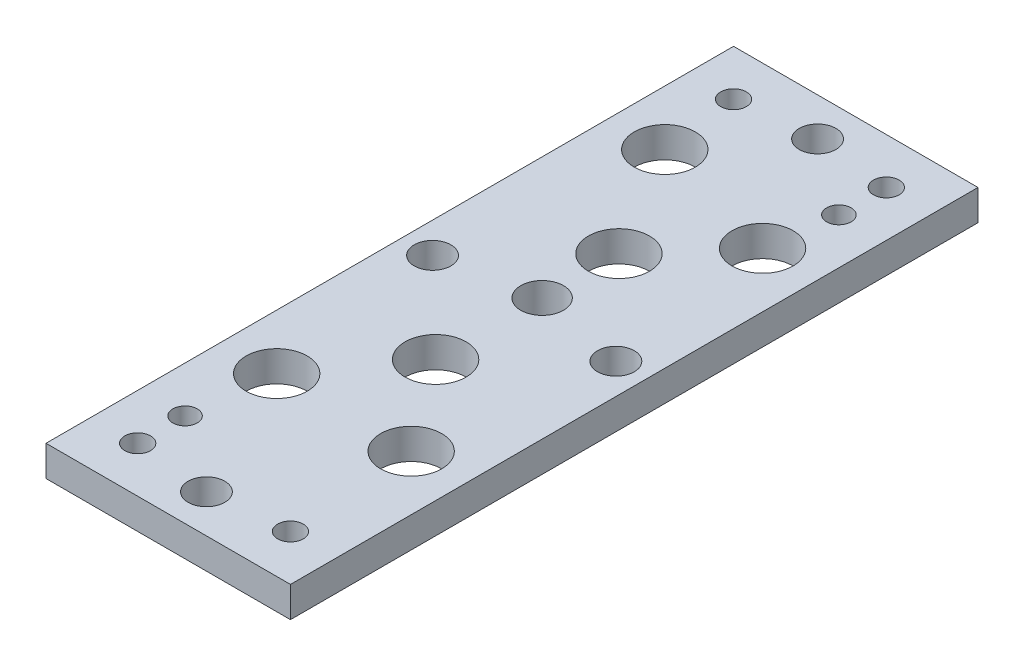
ISO-10303-21;
HEADER;
FILE_DESCRIPTION(('STEP AP214'),'2;1');
FILE_NAME('part.step','',(''),(''),'','','');
FILE_SCHEMA(('AUTOMOTIVE_DESIGN { 1 0 10303 214 1 1 1 1 }'));
ENDSEC;
DATA;
#1=APPLICATION_CONTEXT('core data for automotive mechanical design processes');
#2=APPLICATION_PROTOCOL_DEFINITION('international standard','automotive_design',2000,#1);
#3=PRODUCT_CONTEXT('',#1,'mechanical');
#4=PRODUCT('Part','Part','',(#3));
#5=PRODUCT_RELATED_PRODUCT_CATEGORY('part','',(#4));
#6=PRODUCT_DEFINITION_FORMATION('','',#4);
#7=PRODUCT_DEFINITION_CONTEXT('part definition',#1,'design');
#8=PRODUCT_DEFINITION('design','',#6,#7);
#9=PRODUCT_DEFINITION_SHAPE('','',#8);
#10=(LENGTH_UNIT() NAMED_UNIT(*) SI_UNIT(.MILLI.,.METRE.));
#11=(NAMED_UNIT(*) PLANE_ANGLE_UNIT() SI_UNIT($,.RADIAN.));
#12=(NAMED_UNIT(*) SI_UNIT($,.STERADIAN.) SOLID_ANGLE_UNIT());
#13=UNCERTAINTY_MEASURE_WITH_UNIT(LENGTH_MEASURE(1.E-05),#10,'distance_accuracy_value','');
#14=(GEOMETRIC_REPRESENTATION_CONTEXT(3) GLOBAL_UNCERTAINTY_ASSIGNED_CONTEXT((#13)) GLOBAL_UNIT_ASSIGNED_CONTEXT((#10,
#11,#12)) REPRESENTATION_CONTEXT('',''));
#15=CARTESIAN_POINT('',(0.,0.,0.));
#16=DIRECTION('',(0.,0.,1.));
#17=DIRECTION('',(1.,0.,0.));
#18=AXIS2_PLACEMENT_3D('',#15,#16,#17);
#19=CARTESIAN_POINT('',(40.,-10.,112.5));
#20=DIRECTION('',(1.,0.,0.));
#21=DIRECTION('',(0.,0.,-1.));
#22=AXIS2_PLACEMENT_3D('',#19,#20,#21);
#23=PLANE('',#22);
#24=DIRECTION('',(0.,0.,-1.));
#25=VECTOR('',#24,1.);
#26=CARTESIAN_POINT('',(40.,0.,112.5));
#27=LINE('',#26,#25);
#28=CARTESIAN_POINT('',(40.,0.,112.5));
#29=VERTEX_POINT('',#28);
#30=CARTESIAN_POINT('',(40.,0.,-112.5));
#31=VERTEX_POINT('',#30);
#32=EDGE_CURVE('E105',#29,#31,#27,.T.);
#33=ORIENTED_EDGE('',*,*,#32,.F.);
#34=DIRECTION('',(0.,1.,0.));
#35=VECTOR('',#34,1.);
#36=CARTESIAN_POINT('',(40.,-10.,112.5));
#37=LINE('',#36,#35);
#38=CARTESIAN_POINT('',(40.,-10.,112.5));
#39=VERTEX_POINT('',#38);
#40=EDGE_CURVE('E11',#39,#29,#37,.T.);
#41=ORIENTED_EDGE('',*,*,#40,.F.);
#42=DIRECTION('',(0.,0.,-1.));
#43=VECTOR('',#42,1.);
#44=CARTESIAN_POINT('',(40.,-10.,112.5));
#45=LINE('',#44,#43);
#46=CARTESIAN_POINT('',(40.,-10.,-112.5));
#47=VERTEX_POINT('',#46);
#48=EDGE_CURVE('E98',#39,#47,#45,.T.);
#49=ORIENTED_EDGE('',*,*,#48,.T.);
#50=DIRECTION('',(0.,1.,0.));
#51=VECTOR('',#50,1.);
#52=CARTESIAN_POINT('',(40.,-10.,-112.5));
#53=LINE('',#52,#51);
#54=EDGE_CURVE('E43',#47,#31,#53,.T.);
#55=ORIENTED_EDGE('',*,*,#54,.T.);
#56=EDGE_LOOP('',(#33,#41,#49,#55));
#57=FACE_BOUND('',#56,.T.);
#58=ADVANCED_FACE('F40',(#57),#23,.T.);
#59=CARTESIAN_POINT('',(-40.,-10.,112.5));
#60=DIRECTION('',(0.,0.,1.));
#61=DIRECTION('',(1.,0.,0.));
#62=AXIS2_PLACEMENT_3D('',#59,#60,#61);
#63=PLANE('',#62);
#64=DIRECTION('',(1.,0.,0.));
#65=VECTOR('',#64,1.);
#66=CARTESIAN_POINT('',(-40.,0.,112.5));
#67=LINE('',#66,#65);
#68=CARTESIAN_POINT('',(-40.,0.,112.5));
#69=VERTEX_POINT('',#68);
#70=EDGE_CURVE('E100',#69,#29,#67,.T.);
#71=ORIENTED_EDGE('',*,*,#70,.F.);
#72=DIRECTION('',(0.,1.,0.));
#73=VECTOR('',#72,1.);
#74=CARTESIAN_POINT('',(-40.,-10.,112.5));
#75=LINE('',#74,#73);
#76=CARTESIAN_POINT('',(-40.,-10.,112.5));
#77=VERTEX_POINT('',#76);
#78=EDGE_CURVE('E49',#77,#69,#75,.T.);
#79=ORIENTED_EDGE('',*,*,#78,.F.);
#80=DIRECTION('',(1.,0.,0.));
#81=VECTOR('',#80,1.);
#82=CARTESIAN_POINT('',(-40.,-10.,112.5));
#83=LINE('',#82,#81);
#84=EDGE_CURVE('E95',#77,#39,#83,.T.);
#85=ORIENTED_EDGE('',*,*,#84,.T.);
#86=ORIENTED_EDGE('',*,*,#40,.T.);
#87=EDGE_LOOP('',(#71,#79,#85,#86));
#88=FACE_BOUND('',#87,.T.);
#89=ADVANCED_FACE('F116',(#88),#63,.T.);
#90=CARTESIAN_POINT('',(-40.,-10.,112.5));
#91=DIRECTION('',(-1.,0.,0.));
#92=DIRECTION('',(0.,0.,1.));
#93=AXIS2_PLACEMENT_3D('',#90,#91,#92);
#94=PLANE('',#93);
#95=DIRECTION('',(0.,0.,1.));
#96=VECTOR('',#95,1.);
#97=CARTESIAN_POINT('',(-40.,0.,112.5));
#98=LINE('',#97,#96);
#99=CARTESIAN_POINT('',(-40.,0.,-112.5));
#100=VERTEX_POINT('',#99);
#101=EDGE_CURVE('E90',#100,#69,#98,.T.);
#102=ORIENTED_EDGE('',*,*,#101,.F.);
#103=DIRECTION('',(0.,1.,0.));
#104=VECTOR('',#103,1.);
#105=CARTESIAN_POINT('',(-40.,-10.,-112.5));
#106=LINE('',#105,#104);
#107=CARTESIAN_POINT('',(-40.,-10.,-112.5));
#108=VERTEX_POINT('',#107);
#109=EDGE_CURVE('E85',#108,#100,#106,.T.);
#110=ORIENTED_EDGE('',*,*,#109,.F.);
#111=DIRECTION('',(0.,0.,1.));
#112=VECTOR('',#111,1.);
#113=CARTESIAN_POINT('',(-40.,-10.,112.5));
#114=LINE('',#113,#112);
#115=EDGE_CURVE('E88',#108,#77,#114,.T.);
#116=ORIENTED_EDGE('',*,*,#115,.T.);
#117=ORIENTED_EDGE('',*,*,#78,.T.);
#118=EDGE_LOOP('',(#102,#110,#116,#117));
#119=FACE_BOUND('',#118,.T.);
#120=ADVANCED_FACE('F87',(#119),#94,.T.);
#121=CARTESIAN_POINT('',(-40.,-10.,-112.5));
#122=DIRECTION('',(0.,0.,-1.));
#123=DIRECTION('',(-1.,0.,0.));
#124=AXIS2_PLACEMENT_3D('',#121,#122,#123);
#125=PLANE('',#124);
#126=DIRECTION('',(-1.,0.,0.));
#127=VECTOR('',#126,1.);
#128=CARTESIAN_POINT('',(-40.,0.,-112.5));
#129=LINE('',#128,#127);
#130=EDGE_CURVE('E108',#31,#100,#129,.T.);
#131=ORIENTED_EDGE('',*,*,#130,.F.);
#132=ORIENTED_EDGE('',*,*,#54,.F.);
#133=DIRECTION('',(-1.,0.,0.));
#134=VECTOR('',#133,1.);
#135=CARTESIAN_POINT('',(-40.,-10.,-112.5));
#136=LINE('',#135,#134);
#137=EDGE_CURVE('E94',#47,#108,#136,.T.);
#138=ORIENTED_EDGE('',*,*,#137,.T.);
#139=ORIENTED_EDGE('',*,*,#109,.T.);
#140=EDGE_LOOP('',(#131,#132,#138,#139));
#141=FACE_BOUND('',#140,.T.);
#142=ADVANCED_FACE('F97',(#141),#125,.T.);
#143=CARTESIAN_POINT('',(0.,-10.,0.));
#144=DIRECTION('',(0.,-1.,0.));
#145=DIRECTION('',(0.,0.,-1.));
#146=AXIS2_PLACEMENT_3D('',#143,#144,#145);
#147=PLANE('',#146);
#148=CARTESIAN_POINT('',(22.,-10.,55.));
#149=DIRECTION('',(0.,1.,0.));
#150=DIRECTION('',(0.,0.,1.));
#151=AXIS2_PLACEMENT_3D('',#148,#149,#150);
#152=CIRCLE('',#151,10.0000000000001);
#153=CARTESIAN_POINT('',(22.,-10.,65.0000000000001));
#154=VERTEX_POINT('',#153);
#155=EDGE_CURVE('E240',#154,#154,#152,.T.);
#156=ORIENTED_EDGE('',*,*,#155,.T.);
#157=EDGE_LOOP('',(#156));
#158=FACE_BOUND('',#157,.T.);
#159=CARTESIAN_POINT('',(-22.,-10.,55.));
#160=DIRECTION('',(0.,1.,0.));
#161=DIRECTION('',(0.,0.,1.));
#162=AXIS2_PLACEMENT_3D('',#159,#160,#161);
#163=CIRCLE('',#162,10.0000000000001);
#164=CARTESIAN_POINT('',(-22.,-10.,65.0000000000001));
#165=VERTEX_POINT('',#164);
#166=EDGE_CURVE('E234',#165,#165,#163,.T.);
#167=ORIENTED_EDGE('',*,*,#166,.T.);
#168=EDGE_LOOP('',(#167));
#169=FACE_BOUND('',#168,.T.);
#170=CARTESIAN_POINT('',(0.,-10.,25.));
#171=DIRECTION('',(0.,1.,0.));
#172=DIRECTION('',(0.,0.,1.));
#173=AXIS2_PLACEMENT_3D('',#170,#171,#172);
#174=CIRCLE('',#173,10.0000000000001);
#175=CARTESIAN_POINT('',(0.,-10.,35.0000000000001));
#176=VERTEX_POINT('',#175);
#177=EDGE_CURVE('E228',#176,#176,#174,.T.);
#178=ORIENTED_EDGE('',*,*,#177,.T.);
#179=EDGE_LOOP('',(#178));
#180=FACE_BOUND('',#179,.T.);
#181=CARTESIAN_POINT('',(0.,-10.,-35.));
#182=DIRECTION('',(0.,1.,0.));
#183=DIRECTION('',(0.,0.,1.));
#184=AXIS2_PLACEMENT_3D('',#181,#182,#183);
#185=CIRCLE('',#184,10.0000000000001);
#186=CARTESIAN_POINT('',(0.,-10.,-24.9999999999999));
#187=VERTEX_POINT('',#186);
#188=EDGE_CURVE('E220',#187,#187,#185,.T.);
#189=ORIENTED_EDGE('',*,*,#188,.T.);
#190=EDGE_LOOP('',(#189));
#191=FACE_BOUND('',#190,.T.);
#192=CARTESIAN_POINT('',(-22.,-10.,-72.));
#193=DIRECTION('',(0.,1.,0.));
#194=DIRECTION('',(0.,0.,1.));
#195=AXIS2_PLACEMENT_3D('',#192,#193,#194);
#196=CIRCLE('',#195,10.0000000000001);
#197=CARTESIAN_POINT('',(-22.,-10.,-61.9999999999999));
#198=VERTEX_POINT('',#197);
#199=EDGE_CURVE('E213',#198,#198,#196,.T.);
#200=ORIENTED_EDGE('',*,*,#199,.T.);
#201=EDGE_LOOP('',(#200));
#202=FACE_BOUND('',#201,.T.);
#203=CARTESIAN_POINT('',(22.,-10.,-60.));
#204=DIRECTION('',(0.,1.,0.));
#205=DIRECTION('',(0.,0.,1.));
#206=AXIS2_PLACEMENT_3D('',#203,#204,#205);
#207=CIRCLE('',#206,10.0000000000001);
#208=CARTESIAN_POINT('',(22.,-10.,-50.));
#209=VERTEX_POINT('',#208);
#210=EDGE_CURVE('E215',#209,#209,#207,.T.);
#211=ORIENTED_EDGE('',*,*,#210,.T.);
#212=EDGE_LOOP('',(#211));
#213=FACE_BOUND('',#212,.T.);
#214=CARTESIAN_POINT('',(0.,-10.,-9.85999999999571));
#215=DIRECTION('',(0.,-1.,0.));
#216=DIRECTION('',(0.,0.,-1.));
#217=AXIS2_PLACEMENT_3D('',#214,#215,#216);
#218=CIRCLE('',#217,6.99999999999995);
#219=CARTESIAN_POINT('',(0.,-10.,-16.8599999999957));
#220=VERTEX_POINT('',#219);
#221=EDGE_CURVE('E246',#220,#220,#218,.F.);
#222=ORIENTED_EDGE('',*,*,#221,.T.);
#223=EDGE_LOOP('',(#222));
#224=FACE_BOUND('',#223,.T.);
#225=CARTESIAN_POINT('',(24.9999999999999,-10.,-81.975));
#226=DIRECTION('',(0.,1.,0.));
#227=DIRECTION('',(0.,0.,1.));
#228=AXIS2_PLACEMENT_3D('',#225,#226,#227);
#229=CIRCLE('',#228,4.);
#230=CARTESIAN_POINT('',(24.9999999999999,-10.,-77.975));
#231=VERTEX_POINT('',#230);
#232=EDGE_CURVE('E256',#231,#231,#229,.T.);
#233=ORIENTED_EDGE('',*,*,#232,.T.);
#234=EDGE_LOOP('',(#233));
#235=FACE_BOUND('',#234,.T.);
#236=CARTESIAN_POINT('',(-25.0000000000001,-10.,82.));
#237=DIRECTION('',(0.,1.,0.));
#238=DIRECTION('',(0.,0.,1.));
#239=AXIS2_PLACEMENT_3D('',#236,#237,#238);
#240=CIRCLE('',#239,4.);
#241=CARTESIAN_POINT('',(-25.0000000000001,-10.,86.));
#242=VERTEX_POINT('',#241);
#243=EDGE_CURVE('E262',#242,#242,#240,.T.);
#244=ORIENTED_EDGE('',*,*,#243,.T.);
#245=EDGE_LOOP('',(#244));
#246=FACE_BOUND('',#245,.T.);
#247=CARTESIAN_POINT('',(-25.0000000000001,-10.,-97.5));
#248=DIRECTION('',(0.,1.,0.));
#249=DIRECTION('',(0.,0.,1.));
#250=AXIS2_PLACEMENT_3D('',#247,#248,#249);
#251=CIRCLE('',#250,4.2);
#252=CARTESIAN_POINT('',(-25.0000000000001,-10.,-93.3));
#253=VERTEX_POINT('',#252);
#254=EDGE_CURVE('E268',#253,#253,#251,.T.);
#255=ORIENTED_EDGE('',*,*,#254,.T.);
#256=EDGE_LOOP('',(#255));
#257=FACE_BOUND('',#256,.T.);
#258=CARTESIAN_POINT('',(24.9999999999999,-10.,-97.5));
#259=DIRECTION('',(0.,1.,0.));
#260=DIRECTION('',(0.,0.,1.));
#261=AXIS2_PLACEMENT_3D('',#258,#259,#260);
#262=CIRCLE('',#261,4.2);
#263=CARTESIAN_POINT('',(24.9999999999999,-10.,-93.3));
#264=VERTEX_POINT('',#263);
#265=EDGE_CURVE('E274',#264,#264,#262,.T.);
#266=ORIENTED_EDGE('',*,*,#265,.T.);
#267=EDGE_LOOP('',(#266));
#268=FACE_BOUND('',#267,.T.);
#269=CARTESIAN_POINT('',(24.9999999999999,-10.,97.5));
#270=DIRECTION('',(0.,1.,0.));
#271=DIRECTION('',(0.,0.,1.));
#272=AXIS2_PLACEMENT_3D('',#269,#270,#271);
#273=CIRCLE('',#272,4.2);
#274=CARTESIAN_POINT('',(24.9999999999999,-10.,101.7));
#275=VERTEX_POINT('',#274);
#276=EDGE_CURVE('E280',#275,#275,#273,.T.);
#277=ORIENTED_EDGE('',*,*,#276,.T.);
#278=EDGE_LOOP('',(#277));
#279=FACE_BOUND('',#278,.T.);
#280=CARTESIAN_POINT('',(-25.0000000000001,-10.,97.5));
#281=DIRECTION('',(0.,1.,0.));
#282=DIRECTION('',(0.,0.,1.));
#283=AXIS2_PLACEMENT_3D('',#280,#281,#282);
#284=CIRCLE('',#283,4.2);
#285=CARTESIAN_POINT('',(-25.0000000000001,-10.,101.7));
#286=VERTEX_POINT('',#285);
#287=EDGE_CURVE('E286',#286,#286,#284,.T.);
#288=ORIENTED_EDGE('',*,*,#287,.T.);
#289=EDGE_LOOP('',(#288));
#290=FACE_BOUND('',#289,.T.);
#291=CARTESIAN_POINT('',(6.10622663543836E-13,-10.,-100.000000000007));
#292=DIRECTION('',(0.,-1.,0.));
#293=DIRECTION('',(0.,0.,-1.));
#294=AXIS2_PLACEMENT_3D('',#291,#292,#293);
#295=CIRCLE('',#294,5.9999999999999);
#296=CARTESIAN_POINT('',(6.10622663543836E-13,-10.,-106.000000000007));
#297=VERTEX_POINT('',#296);
#298=EDGE_CURVE('E292',#297,#297,#295,.F.);
#299=ORIENTED_EDGE('',*,*,#298,.T.);
#300=EDGE_LOOP('',(#299));
#301=FACE_BOUND('',#300,.T.);
#302=CARTESIAN_POINT('',(30.0000000000001,-10.,-4.00000000000001));
#303=DIRECTION('',(0.,-1.,0.));
#304=DIRECTION('',(0.,0.,-1.));
#305=AXIS2_PLACEMENT_3D('',#302,#303,#304);
#306=CIRCLE('',#305,5.9999999999999);
#307=CARTESIAN_POINT('',(30.0000000000001,-10.,-9.99999999999991));
#308=VERTEX_POINT('',#307);
#309=EDGE_CURVE('E295',#308,#308,#306,.F.);
#310=ORIENTED_EDGE('',*,*,#309,.T.);
#311=EDGE_LOOP('',(#310));
#312=FACE_BOUND('',#311,.T.);
#313=CARTESIAN_POINT('',(-29.9999999999999,-10.,-4.00000000000001));
#314=DIRECTION('',(0.,-1.,0.));
#315=DIRECTION('',(0.,0.,-1.));
#316=AXIS2_PLACEMENT_3D('',#313,#314,#315);
#317=CIRCLE('',#316,5.99999999999989);
#318=CARTESIAN_POINT('',(-29.9999999999999,-10.,-9.99999999999991));
#319=VERTEX_POINT('',#318);
#320=EDGE_CURVE('E301',#319,#319,#317,.F.);
#321=ORIENTED_EDGE('',*,*,#320,.T.);
#322=EDGE_LOOP('',(#321));
#323=FACE_BOUND('',#322,.T.);
#324=CARTESIAN_POINT('',(6.10622663543836E-13,-10.,100.000000000003));
#325=DIRECTION('',(0.,-1.,0.));
#326=DIRECTION('',(0.,0.,-1.));
#327=AXIS2_PLACEMENT_3D('',#324,#325,#326);
#328=CIRCLE('',#327,5.9999999999999);
#329=CARTESIAN_POINT('',(6.10622663543836E-13,-10.,94.0000000000029));
#330=VERTEX_POINT('',#329);
#331=EDGE_CURVE('E307',#330,#330,#328,.F.);
#332=ORIENTED_EDGE('',*,*,#331,.T.);
#333=EDGE_LOOP('',(#332));
#334=FACE_BOUND('',#333,.T.);
#335=ORIENTED_EDGE('',*,*,#48,.F.);
#336=ORIENTED_EDGE('',*,*,#84,.F.);
#337=ORIENTED_EDGE('',*,*,#115,.F.);
#338=ORIENTED_EDGE('',*,*,#137,.F.);
#339=EDGE_LOOP('',(#335,#336,#337,#338));
#340=FACE_BOUND('',#339,.T.);
#341=ADVANCED_FACE('F93',(#158,#169,#180,#191,#202,#213,#224,#235,#246,#257,#268,#279,#290,#301,
#312,#323,#334,#340),#147,.T.);
#342=CARTESIAN_POINT('',(0.,0.,0.));
#343=DIRECTION('',(0.,-1.,0.));
#344=DIRECTION('',(0.,0.,-1.));
#345=AXIS2_PLACEMENT_3D('',#342,#343,#344);
#346=PLANE('',#345);
#347=CARTESIAN_POINT('',(22.,0.,55.));
#348=DIRECTION('',(0.,1.,0.));
#349=DIRECTION('',(0.,0.,1.));
#350=AXIS2_PLACEMENT_3D('',#347,#348,#349);
#351=CIRCLE('',#350,10.0000000000001);
#352=CARTESIAN_POINT('',(22.,0.,65.0000000000001));
#353=VERTEX_POINT('',#352);
#354=EDGE_CURVE('E242',#353,#353,#351,.T.);
#355=ORIENTED_EDGE('',*,*,#354,.F.);
#356=EDGE_LOOP('',(#355));
#357=FACE_BOUND('',#356,.T.);
#358=CARTESIAN_POINT('',(-22.,0.,55.));
#359=DIRECTION('',(0.,1.,0.));
#360=DIRECTION('',(0.,0.,1.));
#361=AXIS2_PLACEMENT_3D('',#358,#359,#360);
#362=CIRCLE('',#361,10.0000000000001);
#363=CARTESIAN_POINT('',(-22.,0.,65.0000000000001));
#364=VERTEX_POINT('',#363);
#365=EDGE_CURVE('E237',#364,#364,#362,.T.);
#366=ORIENTED_EDGE('',*,*,#365,.F.);
#367=EDGE_LOOP('',(#366));
#368=FACE_BOUND('',#367,.T.);
#369=CARTESIAN_POINT('',(0.,0.,25.));
#370=DIRECTION('',(0.,1.,0.));
#371=DIRECTION('',(0.,0.,1.));
#372=AXIS2_PLACEMENT_3D('',#369,#370,#371);
#373=CIRCLE('',#372,10.0000000000001);
#374=CARTESIAN_POINT('',(0.,0.,35.0000000000001));
#375=VERTEX_POINT('',#374);
#376=EDGE_CURVE('E231',#375,#375,#373,.T.);
#377=ORIENTED_EDGE('',*,*,#376,.F.);
#378=EDGE_LOOP('',(#377));
#379=FACE_BOUND('',#378,.T.);
#380=CARTESIAN_POINT('',(0.,0.,-35.));
#381=DIRECTION('',(0.,1.,0.));
#382=DIRECTION('',(0.,0.,1.));
#383=AXIS2_PLACEMENT_3D('',#380,#381,#382);
#384=CIRCLE('',#383,10.0000000000001);
#385=CARTESIAN_POINT('',(0.,0.,-24.9999999999999));
#386=VERTEX_POINT('',#385);
#387=EDGE_CURVE('E225',#386,#386,#384,.T.);
#388=ORIENTED_EDGE('',*,*,#387,.F.);
#389=EDGE_LOOP('',(#388));
#390=FACE_BOUND('',#389,.T.);
#391=CARTESIAN_POINT('',(-22.,0.,-72.));
#392=DIRECTION('',(0.,1.,0.));
#393=DIRECTION('',(0.,0.,1.));
#394=AXIS2_PLACEMENT_3D('',#391,#392,#393);
#395=CIRCLE('',#394,10.0000000000001);
#396=CARTESIAN_POINT('',(-22.,0.,-61.9999999999999));
#397=VERTEX_POINT('',#396);
#398=EDGE_CURVE('E210',#397,#397,#395,.T.);
#399=ORIENTED_EDGE('',*,*,#398,.F.);
#400=EDGE_LOOP('',(#399));
#401=FACE_BOUND('',#400,.T.);
#402=CARTESIAN_POINT('',(22.,0.,-60.));
#403=DIRECTION('',(0.,1.,0.));
#404=DIRECTION('',(0.,0.,1.));
#405=AXIS2_PLACEMENT_3D('',#402,#403,#404);
#406=CIRCLE('',#405,10.0000000000001);
#407=CARTESIAN_POINT('',(22.,0.,-50.));
#408=VERTEX_POINT('',#407);
#409=EDGE_CURVE('E218',#408,#408,#406,.T.);
#410=ORIENTED_EDGE('',*,*,#409,.F.);
#411=EDGE_LOOP('',(#410));
#412=FACE_BOUND('',#411,.T.);
#413=CARTESIAN_POINT('',(0.,0.,-9.85999999999571));
#414=DIRECTION('',(0.,1.,0.));
#415=DIRECTION('',(0.,0.,1.));
#416=AXIS2_PLACEMENT_3D('',#413,#414,#415);
#417=CIRCLE('',#416,6.99999999999995);
#418=CARTESIAN_POINT('',(0.,0.,-2.85999999999577));
#419=VERTEX_POINT('',#418);
#420=EDGE_CURVE('E248',#419,#419,#417,.T.);
#421=ORIENTED_EDGE('',*,*,#420,.F.);
#422=EDGE_LOOP('',(#421));
#423=FACE_BOUND('',#422,.T.);
#424=CARTESIAN_POINT('',(24.9999999999999,0.,-81.975));
#425=DIRECTION('',(0.,1.,0.));
#426=DIRECTION('',(0.,0.,1.));
#427=AXIS2_PLACEMENT_3D('',#424,#425,#426);
#428=CIRCLE('',#427,4.);
#429=CARTESIAN_POINT('',(24.9999999999999,0.,-77.975));
#430=VERTEX_POINT('',#429);
#431=EDGE_CURVE('E251',#430,#430,#428,.T.);
#432=ORIENTED_EDGE('',*,*,#431,.F.);
#433=EDGE_LOOP('',(#432));
#434=FACE_BOUND('',#433,.T.);
#435=CARTESIAN_POINT('',(-25.0000000000001,0.,82.));
#436=DIRECTION('',(0.,1.,0.));
#437=DIRECTION('',(0.,0.,1.));
#438=AXIS2_PLACEMENT_3D('',#435,#436,#437);
#439=CIRCLE('',#438,4.);
#440=CARTESIAN_POINT('',(-25.0000000000001,0.,86.));
#441=VERTEX_POINT('',#440);
#442=EDGE_CURVE('E259',#441,#441,#439,.T.);
#443=ORIENTED_EDGE('',*,*,#442,.F.);
#444=EDGE_LOOP('',(#443));
#445=FACE_BOUND('',#444,.T.);
#446=CARTESIAN_POINT('',(-25.0000000000001,0.,-97.5));
#447=DIRECTION('',(0.,1.,0.));
#448=DIRECTION('',(0.,0.,1.));
#449=AXIS2_PLACEMENT_3D('',#446,#447,#448);
#450=CIRCLE('',#449,4.2);
#451=CARTESIAN_POINT('',(-25.0000000000001,0.,-93.3));
#452=VERTEX_POINT('',#451);
#453=EDGE_CURVE('E265',#452,#452,#450,.T.);
#454=ORIENTED_EDGE('',*,*,#453,.F.);
#455=EDGE_LOOP('',(#454));
#456=FACE_BOUND('',#455,.T.);
#457=CARTESIAN_POINT('',(24.9999999999999,0.,-97.5));
#458=DIRECTION('',(0.,1.,0.));
#459=DIRECTION('',(0.,0.,1.));
#460=AXIS2_PLACEMENT_3D('',#457,#458,#459);
#461=CIRCLE('',#460,4.2);
#462=CARTESIAN_POINT('',(24.9999999999999,0.,-93.3));
#463=VERTEX_POINT('',#462);
#464=EDGE_CURVE('E271',#463,#463,#461,.T.);
#465=ORIENTED_EDGE('',*,*,#464,.F.);
#466=EDGE_LOOP('',(#465));
#467=FACE_BOUND('',#466,.T.);
#468=CARTESIAN_POINT('',(24.9999999999999,0.,97.5));
#469=DIRECTION('',(0.,1.,0.));
#470=DIRECTION('',(0.,0.,1.));
#471=AXIS2_PLACEMENT_3D('',#468,#469,#470);
#472=CIRCLE('',#471,4.2);
#473=CARTESIAN_POINT('',(24.9999999999999,0.,101.7));
#474=VERTEX_POINT('',#473);
#475=EDGE_CURVE('E277',#474,#474,#472,.T.);
#476=ORIENTED_EDGE('',*,*,#475,.F.);
#477=EDGE_LOOP('',(#476));
#478=FACE_BOUND('',#477,.T.);
#479=CARTESIAN_POINT('',(-25.0000000000001,0.,97.5));
#480=DIRECTION('',(0.,1.,0.));
#481=DIRECTION('',(0.,0.,1.));
#482=AXIS2_PLACEMENT_3D('',#479,#480,#481);
#483=CIRCLE('',#482,4.2);
#484=CARTESIAN_POINT('',(-25.0000000000001,0.,101.7));
#485=VERTEX_POINT('',#484);
#486=EDGE_CURVE('E283',#485,#485,#483,.T.);
#487=ORIENTED_EDGE('',*,*,#486,.F.);
#488=EDGE_LOOP('',(#487));
#489=FACE_BOUND('',#488,.T.);
#490=CARTESIAN_POINT('',(6.10622663543836E-13,0.,-100.000000000007));
#491=DIRECTION('',(0.,1.,0.));
#492=DIRECTION('',(0.,0.,1.));
#493=AXIS2_PLACEMENT_3D('',#490,#491,#492);
#494=CIRCLE('',#493,5.9999999999999);
#495=CARTESIAN_POINT('',(6.10622663543836E-13,0.,-94.0000000000071));
#496=VERTEX_POINT('',#495);
#497=EDGE_CURVE('E109',#496,#496,#494,.T.);
#498=ORIENTED_EDGE('',*,*,#497,.F.);
#499=EDGE_LOOP('',(#498));
#500=FACE_BOUND('',#499,.T.);
#501=CARTESIAN_POINT('',(30.0000000000001,0.,-4.00000000000001));
#502=DIRECTION('',(0.,1.,0.));
#503=DIRECTION('',(0.,0.,1.));
#504=AXIS2_PLACEMENT_3D('',#501,#502,#503);
#505=CIRCLE('',#504,5.9999999999999);
#506=CARTESIAN_POINT('',(30.0000000000001,0.,1.99999999999988));
#507=VERTEX_POINT('',#506);
#508=EDGE_CURVE('E298',#507,#507,#505,.T.);
#509=ORIENTED_EDGE('',*,*,#508,.F.);
#510=EDGE_LOOP('',(#509));
#511=FACE_BOUND('',#510,.T.);
#512=CARTESIAN_POINT('',(-29.9999999999999,0.,-4.00000000000001));
#513=DIRECTION('',(0.,1.,0.));
#514=DIRECTION('',(0.,0.,1.));
#515=AXIS2_PLACEMENT_3D('',#512,#513,#514);
#516=CIRCLE('',#515,5.99999999999989);
#517=CARTESIAN_POINT('',(-29.9999999999999,0.,1.99999999999988));
#518=VERTEX_POINT('',#517);
#519=EDGE_CURVE('E304',#518,#518,#516,.T.);
#520=ORIENTED_EDGE('',*,*,#519,.F.);
#521=EDGE_LOOP('',(#520));
#522=FACE_BOUND('',#521,.T.);
#523=CARTESIAN_POINT('',(6.10622663543836E-13,0.,100.000000000003));
#524=DIRECTION('',(0.,1.,0.));
#525=DIRECTION('',(0.,0.,1.));
#526=AXIS2_PLACEMENT_3D('',#523,#524,#525);
#527=CIRCLE('',#526,5.9999999999999);
#528=CARTESIAN_POINT('',(6.10622663543836E-13,0.,106.000000000003));
#529=VERTEX_POINT('',#528);
#530=EDGE_CURVE('E289',#529,#529,#527,.T.);
#531=ORIENTED_EDGE('',*,*,#530,.F.);
#532=EDGE_LOOP('',(#531));
#533=FACE_BOUND('',#532,.T.);
#534=ORIENTED_EDGE('',*,*,#32,.T.);
#535=ORIENTED_EDGE('',*,*,#130,.T.);
#536=ORIENTED_EDGE('',*,*,#101,.T.);
#537=ORIENTED_EDGE('',*,*,#70,.T.);
#538=EDGE_LOOP('',(#534,#535,#536,#537));
#539=FACE_BOUND('',#538,.T.);
#540=ADVANCED_FACE('F115',(#357,#368,#379,#390,#401,#412,#423,#434,#445,#456,#467,#478,#489,
#500,#511,#522,#533,#539),#346,.F.);
#541=CARTESIAN_POINT('',(6.10622663543836E-13,-10.001,100.000000000003));
#542=DIRECTION('',(0.,1.,0.));
#543=DIRECTION('',(0.,0.,1.));
#544=AXIS2_PLACEMENT_3D('',#541,#542,#543);
#545=CYLINDRICAL_SURFACE('',#544,5.9999999999999);
#546=ORIENTED_EDGE('',*,*,#331,.F.);
#547=EDGE_LOOP('',(#546));
#548=FACE_BOUND('',#547,.T.);
#549=ORIENTED_EDGE('',*,*,#530,.T.);
#550=EDGE_LOOP('',(#549));
#551=FACE_BOUND('',#550,.T.);
#552=ADVANCED_FACE('F136',(#548,#551),#545,.F.);
#553=CARTESIAN_POINT('',(-29.9999999999999,-10.001,-4.00000000000001));
#554=DIRECTION('',(0.,1.,0.));
#555=DIRECTION('',(0.,0.,1.));
#556=AXIS2_PLACEMENT_3D('',#553,#554,#555);
#557=CYLINDRICAL_SURFACE('',#556,5.99999999999989);
#558=ORIENTED_EDGE('',*,*,#320,.F.);
#559=EDGE_LOOP('',(#558));
#560=FACE_BOUND('',#559,.T.);
#561=ORIENTED_EDGE('',*,*,#519,.T.);
#562=EDGE_LOOP('',(#561));
#563=FACE_BOUND('',#562,.T.);
#564=ADVANCED_FACE('F142',(#560,#563),#557,.F.);
#565=CARTESIAN_POINT('',(30.0000000000001,-10.001,-4.00000000000001));
#566=DIRECTION('',(0.,1.,0.));
#567=DIRECTION('',(0.,0.,1.));
#568=AXIS2_PLACEMENT_3D('',#565,#566,#567);
#569=CYLINDRICAL_SURFACE('',#568,5.9999999999999);
#570=ORIENTED_EDGE('',*,*,#309,.F.);
#571=EDGE_LOOP('',(#570));
#572=FACE_BOUND('',#571,.T.);
#573=ORIENTED_EDGE('',*,*,#508,.T.);
#574=EDGE_LOOP('',(#573));
#575=FACE_BOUND('',#574,.T.);
#576=ADVANCED_FACE('F146',(#572,#575),#569,.F.);
#577=CARTESIAN_POINT('',(6.10622663543836E-13,-10.001,-100.000000000007));
#578=DIRECTION('',(0.,1.,0.));
#579=DIRECTION('',(0.,0.,1.));
#580=AXIS2_PLACEMENT_3D('',#577,#578,#579);
#581=CYLINDRICAL_SURFACE('',#580,5.9999999999999);
#582=ORIENTED_EDGE('',*,*,#298,.F.);
#583=EDGE_LOOP('',(#582));
#584=FACE_BOUND('',#583,.T.);
#585=ORIENTED_EDGE('',*,*,#497,.T.);
#586=EDGE_LOOP('',(#585));
#587=FACE_BOUND('',#586,.T.);
#588=ADVANCED_FACE('F150',(#584,#587),#581,.F.);
#589=CARTESIAN_POINT('',(-25.0000000000001,0.,97.5));
#590=DIRECTION('',(0.,1.,0.));
#591=DIRECTION('',(0.,0.,1.));
#592=AXIS2_PLACEMENT_3D('',#589,#590,#591);
#593=CYLINDRICAL_SURFACE('',#592,4.2);
#594=ORIENTED_EDGE('',*,*,#287,.F.);
#595=EDGE_LOOP('',(#594));
#596=FACE_BOUND('',#595,.T.);
#597=ORIENTED_EDGE('',*,*,#486,.T.);
#598=EDGE_LOOP('',(#597));
#599=FACE_BOUND('',#598,.T.);
#600=ADVANCED_FACE('F154',(#596,#599),#593,.F.);
#601=CARTESIAN_POINT('',(24.9999999999999,0.,97.5));
#602=DIRECTION('',(0.,1.,0.));
#603=DIRECTION('',(0.,0.,1.));
#604=AXIS2_PLACEMENT_3D('',#601,#602,#603);
#605=CYLINDRICAL_SURFACE('',#604,4.2);
#606=ORIENTED_EDGE('',*,*,#276,.F.);
#607=EDGE_LOOP('',(#606));
#608=FACE_BOUND('',#607,.T.);
#609=ORIENTED_EDGE('',*,*,#475,.T.);
#610=EDGE_LOOP('',(#609));
#611=FACE_BOUND('',#610,.T.);
#612=ADVANCED_FACE('F158',(#608,#611),#605,.F.);
#613=CARTESIAN_POINT('',(24.9999999999999,0.,-97.5));
#614=DIRECTION('',(0.,1.,0.));
#615=DIRECTION('',(0.,0.,1.));
#616=AXIS2_PLACEMENT_3D('',#613,#614,#615);
#617=CYLINDRICAL_SURFACE('',#616,4.2);
#618=ORIENTED_EDGE('',*,*,#265,.F.);
#619=EDGE_LOOP('',(#618));
#620=FACE_BOUND('',#619,.T.);
#621=ORIENTED_EDGE('',*,*,#464,.T.);
#622=EDGE_LOOP('',(#621));
#623=FACE_BOUND('',#622,.T.);
#624=ADVANCED_FACE('F162',(#620,#623),#617,.F.);
#625=CARTESIAN_POINT('',(-25.0000000000001,0.,-97.5));
#626=DIRECTION('',(0.,1.,0.));
#627=DIRECTION('',(0.,0.,1.));
#628=AXIS2_PLACEMENT_3D('',#625,#626,#627);
#629=CYLINDRICAL_SURFACE('',#628,4.2);
#630=ORIENTED_EDGE('',*,*,#254,.F.);
#631=EDGE_LOOP('',(#630));
#632=FACE_BOUND('',#631,.T.);
#633=ORIENTED_EDGE('',*,*,#453,.T.);
#634=EDGE_LOOP('',(#633));
#635=FACE_BOUND('',#634,.T.);
#636=ADVANCED_FACE('F166',(#632,#635),#629,.F.);
#637=CARTESIAN_POINT('',(-25.0000000000001,0.,82.));
#638=DIRECTION('',(0.,1.,0.));
#639=DIRECTION('',(0.,0.,1.));
#640=AXIS2_PLACEMENT_3D('',#637,#638,#639);
#641=CYLINDRICAL_SURFACE('',#640,4.);
#642=ORIENTED_EDGE('',*,*,#243,.F.);
#643=EDGE_LOOP('',(#642));
#644=FACE_BOUND('',#643,.T.);
#645=ORIENTED_EDGE('',*,*,#442,.T.);
#646=EDGE_LOOP('',(#645));
#647=FACE_BOUND('',#646,.T.);
#648=ADVANCED_FACE('F170',(#644,#647),#641,.F.);
#649=CARTESIAN_POINT('',(24.9999999999999,0.,-81.975));
#650=DIRECTION('',(0.,1.,0.));
#651=DIRECTION('',(0.,0.,1.));
#652=AXIS2_PLACEMENT_3D('',#649,#650,#651);
#653=CYLINDRICAL_SURFACE('',#652,4.);
#654=ORIENTED_EDGE('',*,*,#232,.F.);
#655=EDGE_LOOP('',(#654));
#656=FACE_BOUND('',#655,.T.);
#657=ORIENTED_EDGE('',*,*,#431,.T.);
#658=EDGE_LOOP('',(#657));
#659=FACE_BOUND('',#658,.T.);
#660=ADVANCED_FACE('F174',(#656,#659),#653,.F.);
#661=CARTESIAN_POINT('',(0.,-10.001,-9.85999999999571));
#662=DIRECTION('',(0.,1.,0.));
#663=DIRECTION('',(0.,0.,1.));
#664=AXIS2_PLACEMENT_3D('',#661,#662,#663);
#665=CYLINDRICAL_SURFACE('',#664,6.99999999999995);
#666=ORIENTED_EDGE('',*,*,#221,.F.);
#667=EDGE_LOOP('',(#666));
#668=FACE_BOUND('',#667,.T.);
#669=ORIENTED_EDGE('',*,*,#420,.T.);
#670=EDGE_LOOP('',(#669));
#671=FACE_BOUND('',#670,.T.);
#672=ADVANCED_FACE('F178',(#668,#671),#665,.F.);
#673=CARTESIAN_POINT('',(22.,0.,-60.));
#674=DIRECTION('',(0.,-1.,0.));
#675=DIRECTION('',(0.,0.,-1.));
#676=AXIS2_PLACEMENT_3D('',#673,#674,#675);
#677=CYLINDRICAL_SURFACE('',#676,10.0000000000001);
#678=ORIENTED_EDGE('',*,*,#409,.T.);
#679=EDGE_LOOP('',(#678));
#680=FACE_BOUND('',#679,.T.);
#681=ORIENTED_EDGE('',*,*,#210,.F.);
#682=EDGE_LOOP('',(#681));
#683=FACE_BOUND('',#682,.T.);
#684=ADVANCED_FACE('F181',(#680,#683),#677,.F.);
#685=CARTESIAN_POINT('',(-22.,0.,-72.));
#686=DIRECTION('',(0.,-1.,0.));
#687=DIRECTION('',(0.,0.,-1.));
#688=AXIS2_PLACEMENT_3D('',#685,#686,#687);
#689=CYLINDRICAL_SURFACE('',#688,10.0000000000001);
#690=ORIENTED_EDGE('',*,*,#398,.T.);
#691=EDGE_LOOP('',(#690));
#692=FACE_BOUND('',#691,.T.);
#693=ORIENTED_EDGE('',*,*,#199,.F.);
#694=EDGE_LOOP('',(#693));
#695=FACE_BOUND('',#694,.T.);
#696=ADVANCED_FACE('F185',(#692,#695),#689,.F.);
#697=CARTESIAN_POINT('',(0.,0.,-35.));
#698=DIRECTION('',(0.,-1.,0.));
#699=DIRECTION('',(0.,0.,-1.));
#700=AXIS2_PLACEMENT_3D('',#697,#698,#699);
#701=CYLINDRICAL_SURFACE('',#700,10.0000000000001);
#702=ORIENTED_EDGE('',*,*,#387,.T.);
#703=EDGE_LOOP('',(#702));
#704=FACE_BOUND('',#703,.T.);
#705=ORIENTED_EDGE('',*,*,#188,.F.);
#706=EDGE_LOOP('',(#705));
#707=FACE_BOUND('',#706,.T.);
#708=ADVANCED_FACE('F198',(#704,#707),#701,.F.);
#709=CARTESIAN_POINT('',(0.,0.,25.));
#710=DIRECTION('',(0.,-1.,0.));
#711=DIRECTION('',(0.,0.,-1.));
#712=AXIS2_PLACEMENT_3D('',#709,#710,#711);
#713=CYLINDRICAL_SURFACE('',#712,10.0000000000001);
#714=ORIENTED_EDGE('',*,*,#376,.T.);
#715=EDGE_LOOP('',(#714));
#716=FACE_BOUND('',#715,.T.);
#717=ORIENTED_EDGE('',*,*,#177,.F.);
#718=EDGE_LOOP('',(#717));
#719=FACE_BOUND('',#718,.T.);
#720=ADVANCED_FACE('F194',(#716,#719),#713,.F.);
#721=CARTESIAN_POINT('',(-22.,0.,55.));
#722=DIRECTION('',(0.,-1.,0.));
#723=DIRECTION('',(0.,0.,-1.));
#724=AXIS2_PLACEMENT_3D('',#721,#722,#723);
#725=CYLINDRICAL_SURFACE('',#724,10.0000000000001);
#726=ORIENTED_EDGE('',*,*,#365,.T.);
#727=EDGE_LOOP('',(#726));
#728=FACE_BOUND('',#727,.T.);
#729=ORIENTED_EDGE('',*,*,#166,.F.);
#730=EDGE_LOOP('',(#729));
#731=FACE_BOUND('',#730,.T.);
#732=ADVANCED_FACE('F190',(#728,#731),#725,.F.);
#733=CARTESIAN_POINT('',(22.,0.,55.));
#734=DIRECTION('',(0.,-1.,0.));
#735=DIRECTION('',(0.,0.,-1.));
#736=AXIS2_PLACEMENT_3D('',#733,#734,#735);
#737=CYLINDRICAL_SURFACE('',#736,10.0000000000001);
#738=ORIENTED_EDGE('',*,*,#354,.T.);
#739=EDGE_LOOP('',(#738));
#740=FACE_BOUND('',#739,.T.);
#741=ORIENTED_EDGE('',*,*,#155,.F.);
#742=EDGE_LOOP('',(#741));
#743=FACE_BOUND('',#742,.T.);
#744=ADVANCED_FACE('F187',(#740,#743),#737,.F.);
#745=CLOSED_SHELL('',(#58,#89,#120,#142,#341,#540,#552,#564,#576,#588,#600,#612,#624,#636,#648,
#660,#672,#684,#696,#708,#720,#732,#744));
#746=MANIFOLD_SOLID_BREP('B2',#745);
#747=ADVANCED_BREP_SHAPE_REPRESENTATION('',(#18,#746),#14);
#748=SHAPE_DEFINITION_REPRESENTATION(#9,#747);
ENDSEC;
END-ISO-10303-21;
